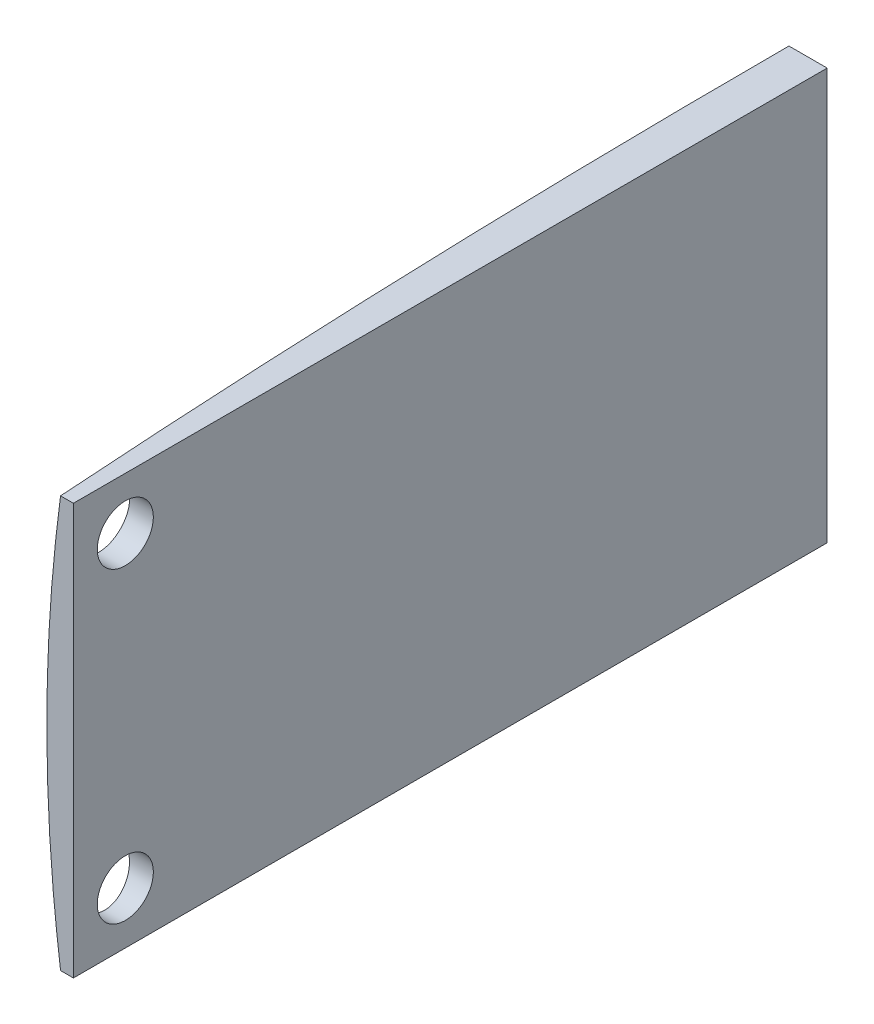
ISO-10303-21;
HEADER;
FILE_DESCRIPTION(('STEP AP214'),'2;1');
FILE_NAME('part.step','',(''),(''),'','','');
FILE_SCHEMA(('AUTOMOTIVE_DESIGN { 1 0 10303 214 1 1 1 1 }'));
ENDSEC;
DATA;
#1=APPLICATION_CONTEXT('core data for automotive mechanical design processes');
#2=APPLICATION_PROTOCOL_DEFINITION('international standard','automotive_design',2000,#1);
#3=PRODUCT_CONTEXT('',#1,'mechanical');
#4=PRODUCT('Part','Part','',(#3));
#5=PRODUCT_RELATED_PRODUCT_CATEGORY('part','',(#4));
#6=PRODUCT_DEFINITION_FORMATION('','',#4);
#7=PRODUCT_DEFINITION_CONTEXT('part definition',#1,'design');
#8=PRODUCT_DEFINITION('design','',#6,#7);
#9=PRODUCT_DEFINITION_SHAPE('','',#8);
#10=(LENGTH_UNIT() NAMED_UNIT(*) SI_UNIT(.MILLI.,.METRE.));
#11=(NAMED_UNIT(*) PLANE_ANGLE_UNIT() SI_UNIT($,.RADIAN.));
#12=(NAMED_UNIT(*) SI_UNIT($,.STERADIAN.) SOLID_ANGLE_UNIT());
#13=UNCERTAINTY_MEASURE_WITH_UNIT(LENGTH_MEASURE(1.E-05),#10,'distance_accuracy_value','');
#14=(GEOMETRIC_REPRESENTATION_CONTEXT(3) GLOBAL_UNCERTAINTY_ASSIGNED_CONTEXT((#13)) GLOBAL_UNIT_ASSIGNED_CONTEXT((#10,
#11,#12)) REPRESENTATION_CONTEXT('',''));
#15=CARTESIAN_POINT('',(0.,0.,0.));
#16=DIRECTION('',(0.,0.,1.));
#17=DIRECTION('',(1.,0.,0.));
#18=AXIS2_PLACEMENT_3D('',#15,#16,#17);
#19=CARTESIAN_POINT('',(-1.2E-05,25.146,0.));
#20=DIRECTION('',(0.,1.,0.));
#21=DIRECTION('',(0.,0.,1.));
#22=AXIS2_PLACEMENT_3D('',#19,#20,#21);
#23=PLANE('',#22);
#24=DIRECTION('',(1.,0.,0.));
#25=VECTOR('',#24,1.);
#26=CARTESIAN_POINT('',(-1.2E-05,25.146,0.));
#27=LINE('',#26,#25);
#28=CARTESIAN_POINT('',(1.67458040176172,25.146,0.));
#29=VERTEX_POINT('',#28);
#30=CARTESIAN_POINT('',(6.35,25.146,0.));
#31=VERTEX_POINT('',#30);
#32=EDGE_CURVE('E101',#29,#31,#27,.T.);
#33=ORIENTED_EDGE('',*,*,#32,.F.);
#34=CARTESIAN_POINT('',(1372.87,25.1460000000003,0.));
#35=DIRECTION('',(0.,-1.,0.));
#36=DIRECTION('',(1.,0.,0.));
#37=AXIS2_PLACEMENT_3D('',#34,#35,#36);
#38=CIRCLE('',#37,1371.19541959824);
#39=CARTESIAN_POINT('',(4.77801847127677,25.146,92.2020000000002));
#40=VERTEX_POINT('',#39);
#41=EDGE_CURVE('E94',#29,#40,#38,.F.);
#42=ORIENTED_EDGE('',*,*,#41,.T.);
#43=DIRECTION('',(1.,0.,0.));
#44=VECTOR('',#43,1.);
#45=CARTESIAN_POINT('',(-1.2E-05,25.146,92.2020000000001));
#46=LINE('',#45,#44);
#47=CARTESIAN_POINT('',(6.35,25.146,92.2020000000001));
#48=VERTEX_POINT('',#47);
#49=EDGE_CURVE('E140',#40,#48,#46,.T.);
#50=ORIENTED_EDGE('',*,*,#49,.T.);
#51=DIRECTION('',(0.,0.,1.));
#52=VECTOR('',#51,1.);
#53=CARTESIAN_POINT('',(6.35,25.146,-92.2020000000001));
#54=LINE('',#53,#52);
#55=EDGE_CURVE('E107',#31,#48,#54,.T.);
#56=ORIENTED_EDGE('',*,*,#55,.F.);
#57=EDGE_LOOP('',(#33,#42,#50,#56));
#58=FACE_BOUND('',#57,.T.);
#59=ADVANCED_FACE('F84',(#58),#23,.T.);
#60=CARTESIAN_POINT('',(-1.2E-05,-25.146,0.));
#61=DIRECTION('',(0.,1.,0.));
#62=DIRECTION('',(0.,0.,1.));
#63=AXIS2_PLACEMENT_3D('',#60,#61,#62);
#64=PLANE('',#63);
#65=CARTESIAN_POINT('',(1372.87,-25.1459999999997,0.));
#66=DIRECTION('',(0.,-1.,0.));
#67=DIRECTION('',(1.,0.,0.));
#68=AXIS2_PLACEMENT_3D('',#65,#66,#67);
#69=CIRCLE('',#68,1371.19541959824);
#70=CARTESIAN_POINT('',(1.67458040176194,-25.146,0.));
#71=VERTEX_POINT('',#70);
#72=CARTESIAN_POINT('',(4.77801847127669,-25.146,92.2020000000001));
#73=VERTEX_POINT('',#72);
#74=EDGE_CURVE('E135',#71,#73,#69,.F.);
#75=ORIENTED_EDGE('',*,*,#74,.F.);
#76=DIRECTION('',(1.,0.,0.));
#77=VECTOR('',#76,1.);
#78=CARTESIAN_POINT('',(-1.2E-05,-25.146,0.));
#79=LINE('',#78,#77);
#80=CARTESIAN_POINT('',(6.35,-25.146,0.));
#81=VERTEX_POINT('',#80);
#82=EDGE_CURVE('E125',#71,#81,#79,.T.);
#83=ORIENTED_EDGE('',*,*,#82,.T.);
#84=DIRECTION('',(0.,0.,-1.));
#85=VECTOR('',#84,1.);
#86=CARTESIAN_POINT('',(6.35,-25.146,-92.2020000000001));
#87=LINE('',#86,#85);
#88=CARTESIAN_POINT('',(6.35,-25.146,92.2020000000001));
#89=VERTEX_POINT('',#88);
#90=EDGE_CURVE('E133',#89,#81,#87,.T.);
#91=ORIENTED_EDGE('',*,*,#90,.F.);
#92=DIRECTION('',(1.,0.,0.));
#93=VECTOR('',#92,1.);
#94=CARTESIAN_POINT('',(-1.2E-05,-25.146,92.2020000000001));
#95=LINE('',#94,#93);
#96=EDGE_CURVE('E146',#73,#89,#95,.T.);
#97=ORIENTED_EDGE('',*,*,#96,.F.);
#98=EDGE_LOOP('',(#75,#83,#91,#97));
#99=FACE_BOUND('',#98,.T.);
#100=ADVANCED_FACE('F131',(#99),#64,.F.);
#101=CARTESIAN_POINT('',(-1.2E-05,0.,92.2020000000001));
#102=DIRECTION('',(0.,0.,1.));
#103=DIRECTION('',(1.,0.,0.));
#104=AXIS2_PLACEMENT_3D('',#101,#102,#103);
#105=PLANE('',#104);
#106=DIRECTION('',(0.,-1.,0.));
#107=VECTOR('',#106,1.);
#108=CARTESIAN_POINT('',(6.35,25.146,92.2020000000001));
#109=LINE('',#108,#107);
#110=EDGE_CURVE('E138',#48,#89,#109,.T.);
#111=ORIENTED_EDGE('',*,*,#110,.F.);
#112=ORIENTED_EDGE('',*,*,#49,.F.);
#113=CARTESIAN_POINT('',(4.77801847127677,25.146,92.2020000000002));
#114=CARTESIAN_POINT('',(4.59166788954078,23.7509410775316,92.2020000000001));
#115=CARTESIAN_POINT('',(4.42060734687266,22.3538353400213,92.2020000000001));
#116=CARTESIAN_POINT('',(4.10970318609752,19.5596122735176,92.202));
#117=CARTESIAN_POINT('',(3.96978429647136,18.162503317759,92.2020000000001));
#118=CARTESIAN_POINT('',(3.72113135185098,15.368275175018,92.2020000000001));
#119=CARTESIAN_POINT('',(3.61233662996028,13.9711613899426,92.2020000000001));
#120=CARTESIAN_POINT('',(3.42589241107428,11.1769289071129,92.2020000000001));
#121=CARTESIAN_POINT('',(3.34819715871108,9.77981326328064,92.2020000000001));
#122=CARTESIAN_POINT('',(3.22392182470786,6.98557999081025,92.2020000000001));
#123=CARTESIAN_POINT('',(3.17731110585369,5.58846372535655,92.2020000000001));
#124=CARTESIAN_POINT('',(3.11517989386899,2.79423141199114,92.2020000000001));
#125=CARTESIAN_POINT('',(3.09964402933586,1.3971157059956,92.2020000000001));
#126=CARTESIAN_POINT('',(3.09964402933586,-1.39711570599547,92.2020000000001));
#127=CARTESIAN_POINT('',(3.11517989386898,-2.79423141199101,92.2020000000001));
#128=CARTESIAN_POINT('',(3.17731110585368,-5.58846372535641,92.2020000000001));
#129=CARTESIAN_POINT('',(3.22392182470786,-6.98557999081011,92.2020000000001));
#130=CARTESIAN_POINT('',(3.34819715871109,-9.77981326328051,92.2020000000001));
#131=CARTESIAN_POINT('',(3.42589241107429,-11.1769289071128,92.2020000000001));
#132=CARTESIAN_POINT('',(3.61233662996026,-13.9711613899424,92.2020000000001));
#133=CARTESIAN_POINT('',(3.72113135185093,-15.3682751750178,92.2020000000001));
#134=CARTESIAN_POINT('',(3.96978429647142,-18.1625033177588,92.202));
#135=CARTESIAN_POINT('',(4.1097031860977,-19.5596122735174,92.202));
#136=CARTESIAN_POINT('',(4.42060734687293,-22.3538353400211,92.2020000000001));
#137=CARTESIAN_POINT('',(4.591667889541,-23.7509410775315,92.2020000000002));
#138=CARTESIAN_POINT('',(4.77801847127669,-25.1459999999999,92.2020000000004));
#139=B_SPLINE_CURVE_WITH_KNOTS('',3,(#113,#114,#115,#116,#117,#118,#119,#120,#121,#122,#123,
#124,#125,#126,#127,#128,#129,#130,#131,#132,#133,#134,#135,#136,#137,#138),.UNSPECIFIED.,.F.,
.F.,(4,2,2,2,2,2,2,2,2,2,2,2,4),(0.,4.22227231704978,8.43422552238614,12.6379120074765,
16.8353908464465,21.0287264716252,25.2199873193706,29.411248167116,33.6045837922947,
37.8020626312646,42.005749116355,46.2177023216914,50.4399746387411),.UNSPECIFIED.);
#140=EDGE_CURVE('E148',#40,#73,#139,.T.);
#141=ORIENTED_EDGE('',*,*,#140,.T.);
#142=ORIENTED_EDGE('',*,*,#96,.T.);
#143=EDGE_LOOP('',(#111,#112,#141,#142));
#144=FACE_BOUND('',#143,.T.);
#145=ADVANCED_FACE('F159',(#144),#105,.T.);
#146=CARTESIAN_POINT('',(1372.87,4.16333634234434E-13,0.));
#147=DIRECTION('',(0.,0.,1.));
#148=DIRECTION('',(-1.,0.,0.));
#149=AXIS2_PLACEMENT_3D('',#146,#147,#148);
#150=ELLIPSE('',#149,1372.87,509.27);
#151=TRIMMED_CURVE('',#150,(PARAMETER_VALUE(4.71238898038469)),
(PARAMETER_VALUE(7.85398163397448)),.T.,.PARAMETER.);
#152=CARTESIAN_POINT('',(1372.87,-509.27,0.));
#153=DIRECTION('',(0.,-1.,0.));
#154=AXIS1_PLACEMENT('',#152,#153);
#155=SURFACE_OF_REVOLUTION('',#151,#154);
#156=CARTESIAN_POINT('',(3.41350704445606,-18.7960000000001,82.4229999999998));
#157=CARTESIAN_POINT('',(3.39436924449468,-18.604119081168,82.4230081902815));
#158=CARTESIAN_POINT('',(3.37647283640744,-18.4119806937496,82.4391583975194));
#159=CARTESIAN_POINT('',(3.34367398813089,-18.032721251482,82.5034903101904));
#160=CARTESIAN_POINT('',(3.32877489487117,-17.8456060054322,82.5517075672993));
#161=CARTESIAN_POINT('',(3.30236212515313,-17.4819154557681,82.6789392865821));
#162=CARTESIAN_POINT('',(3.29084784954422,-17.3053382912111,82.7579482925061));
#163=CARTESIAN_POINT('',(3.27145073922401,-16.9678515354919,82.944579968504));
#164=CARTESIAN_POINT('',(3.26356701345374,-16.8069381075762,83.0521956073107));
#165=CARTESIAN_POINT('',(3.25156916637721,-16.5060861165859,83.2924638461406));
#166=CARTESIAN_POINT('',(3.24743798055722,-16.3660550481094,83.4249997651269));
#167=CARTESIAN_POINT('',(3.24287821607497,-16.1101166755428,83.7116744257249));
#168=CARTESIAN_POINT('',(3.24244969960849,-15.9942097767116,83.865813530173));
#169=CARTESIAN_POINT('',(3.24518102488363,-15.7901322264324,84.190821271636));
#170=CARTESIAN_POINT('',(3.24833056339875,-15.7018828650054,84.3616405851406));
#171=CARTESIAN_POINT('',(3.25800530284286,-15.5551429541796,84.7155236513587));
#172=CARTESIAN_POINT('',(3.26453050304707,-15.4966523983913,84.8985874014431));
#173=CARTESIAN_POINT('',(3.28070395535928,-15.4109726543096,85.2720190975045));
#174=CARTESIAN_POINT('',(3.29035633501652,-15.3838250527518,85.4623964022603));
#175=CARTESIAN_POINT('',(3.31246718546412,-15.3616612924836,85.8448482887754));
#176=CARTESIAN_POINT('',(3.32492570435777,-15.3666456846254,86.0369228995759));
#177=CARTESIAN_POINT('',(3.35235683562903,-15.4086100932746,86.4181848529888));
#178=CARTESIAN_POINT('',(3.36733983490417,-15.4457250331258,86.607356592118));
#179=CARTESIAN_POINT('',(3.39940306423604,-15.5509983545396,86.9766674521292));
#180=CARTESIAN_POINT('',(3.41648335189289,-15.6191575888449,87.1568063247403));
#181=CARTESIAN_POINT('',(3.45243620798375,-15.784965265031,87.5039387477428));
#182=CARTESIAN_POINT('',(3.4713177116811,-15.8827665853303,87.6708583521395));
#183=CARTESIAN_POINT('',(3.51037331166312,-16.1049055254905,87.9858208545134));
#184=CARTESIAN_POINT('',(3.53054744113028,-16.2292438267629,88.1338632676097));
#185=CARTESIAN_POINT('',(3.57184113580011,-16.5015425166185,88.4075706136945));
#186=CARTESIAN_POINT('',(3.59296462139546,-16.6496088847134,88.5331295316539));
#187=CARTESIAN_POINT('',(3.63560020075704,-16.9647351368877,88.7574988717373));
#188=CARTESIAN_POINT('',(3.65711230185124,-17.1317953794425,88.8563087889028));
#189=CARTESIAN_POINT('',(3.70008804217545,-17.4806424059071,89.0246138482065));
#190=CARTESIAN_POINT('',(3.72155140317321,-17.6624669344756,89.0940308440073));
#191=CARTESIAN_POINT('',(3.76384970917498,-18.0352963196945,89.2011777819392));
#192=CARTESIAN_POINT('',(3.78468465093096,-18.2263012237812,89.2389075603191));
#193=CARTESIAN_POINT('',(3.82517652506733,-18.6120145554397,89.2815522318385));
#194=CARTESIAN_POINT('',(3.84483376312878,-18.8067220045538,89.2864756769748));
#195=CARTESIAN_POINT('',(3.8824183866231,-19.1943354249303,89.2633139794076));
#196=CARTESIAN_POINT('',(3.9003457950794,-19.3872414201387,89.2352292760968));
#197=CARTESIAN_POINT('',(3.93385392945994,-19.7650410227885,89.1469204053276));
#198=CARTESIAN_POINT('',(3.94944272919586,-19.9499605503536,89.0868102355343));
#199=CARTESIAN_POINT('',(3.97781730870516,-20.3071832618522,88.9361431952549));
#200=CARTESIAN_POINT('',(3.99060317730041,-20.479486845456,88.8455872897919));
#201=CARTESIAN_POINT('',(4.01281796319867,-20.8054768614454,88.6371828582815));
#202=CARTESIAN_POINT('',(4.02226673317374,-20.9592696782183,88.5195028656688));
#203=CARTESIAN_POINT('',(4.03750913635277,-21.244982281914,88.2598587821897));
#204=CARTESIAN_POINT('',(4.04330290983706,-21.3769029081577,88.1178956235874));
#205=CARTESIAN_POINT('',(4.05090809279776,-21.6142804070262,87.8146957469961));
#206=CARTESIAN_POINT('',(4.05274429795652,-21.7198983640387,87.6535857461927));
#207=CARTESIAN_POINT('',(4.05233601958529,-21.9027096335515,87.3159817664341));
#208=CARTESIAN_POINT('',(4.05009164701617,-21.9799037188976,87.1394882059199));
#209=CARTESIAN_POINT('',(4.04151020934487,-22.103479307986,86.7767755191631));
#210=CARTESIAN_POINT('',(4.03518669060879,-22.1499617709341,86.5905904518314));
#211=CARTESIAN_POINT('',(4.0185884826606,-22.2112705070118,86.2132542495819));
#212=CARTESIAN_POINT('',(4.00831377505975,-22.2260966328115,86.022103091556));
#213=CARTESIAN_POINT('',(3.98407174010512,-22.2237744798371,85.6398498950725));
#214=CARTESIAN_POINT('',(3.97009705212219,-22.2065620482987,85.4487487231371));
#215=CARTESIAN_POINT('',(3.93889387011699,-22.1406484150268,85.0723330225271));
#216=CARTESIAN_POINT('',(3.9216652616403,-22.0919461055123,84.8870186976682));
#217=CARTESIAN_POINT('',(3.88437960714267,-21.9640944558238,84.5260545565194));
#218=CARTESIAN_POINT('',(3.86430381303016,-21.8847367506997,84.3504804941748));
#219=CARTESIAN_POINT('',(3.82208244768968,-21.6979346704605,84.0152535002833));
#220=CARTESIAN_POINT('',(3.79993685884129,-21.5904900562243,83.8556007042999));
#221=CARTESIAN_POINT('',(3.75412401414667,-21.3495795495937,83.5553446725656));
#222=CARTESIAN_POINT('',(3.73044569749712,-21.2159059939297,83.4149097309676));
#223=CARTESIAN_POINT('',(3.68252289717338,-20.9268604890281,83.1585261267026));
#224=CARTESIAN_POINT('',(3.65827825672448,-20.7714824706403,83.0425843358385));
#225=CARTESIAN_POINT('',(3.60989585481394,-20.4424877683889,82.8378860664344));
#226=CARTESIAN_POINT('',(3.58575950008213,-20.2687717515998,82.7492890397701));
#227=CARTESIAN_POINT('',(3.53854542534951,-19.9088696480864,82.6028118190587));
#228=CARTESIAN_POINT('',(3.51546648778287,-19.7226985434441,82.5448954420733));
#229=CARTESIAN_POINT('',(3.47915655607885,-19.412153359851,82.4765377484962));
#230=CARTESIAN_POINT('',(3.46539120048416,-19.2898716736846,82.4564950767566));
#231=CARTESIAN_POINT('',(3.4387469495815,-19.0437624626048,82.4297235533334));
#232=CARTESIAN_POINT('',(3.42586805482533,-18.9199349367293,82.4229947099374));
#233=CARTESIAN_POINT('',(3.41350704445606,-18.7960000000001,82.4229999999998));
#234=B_SPLINE_CURVE_WITH_KNOTS('',3,(#156,#157,#158,#159,#160,#161,#162,#163,#164,#165,#166,
#167,#168,#169,#170,#171,#172,#173,#174,#175,#176,#177,#178,#179,#180,#181,#182,#183,#184,#185,
#186,#187,#188,#189,#190,#191,#192,#193,#194,#195,#196,#197,#198,#199,#200,#201,#202,#203,#204,
#205,#206,#207,#208,#209,#210,#211,#212,#213,#214,#215,#216,#217,#218,#219,#220,#221,#222,#223,
#224,#225,#226,#227,#228,#229,#230,#231,#232,#233),.UNSPECIFIED.,.T.,.F.,(4,2,2,2,2,2,2,2,2,2,2,
2,2,2,2,2,2,2,2,2,2,2,2,2,2,2,2,2,2,2,2,2,2,2,2,2,2,2,4),(0.,0.578048596796749,1.15673912764821,
1.7353271620332,2.31377311568276,2.88957524715575,3.46538705067622,4.0395449627162,
4.61370275148024,5.1886214770235,5.76355005866543,6.34090466930412,6.9182751400105,
7.49867557600114,8.0790909171977,8.66217484973487,9.24526978876603,9.82990540127515,
10.4145440350094,10.9990302584374,11.5835087014819,12.1659204040164,12.7483136478824,
13.3271813917407,13.9060269170555,14.481235081436,15.0564276047369,15.6297197466272,
16.2030145566377,16.7774585450215,17.3519227428453,17.9303623038489,18.5088067896243,
19.0920306153492,19.6754178537877,20.2621453094476,20.848179264349,21.2215377624882,
21.5948964930304),.UNSPECIFIED.);
#235=CARTESIAN_POINT('',(3.41350704445606,-18.7960000000001,82.4229999999998));
#236=VERTEX_POINT('',#235);
#237=EDGE_CURVE('E142',#236,#236,#234,.T.);
#238=ORIENTED_EDGE('',*,*,#237,.T.);
#239=EDGE_LOOP('',(#238));
#240=FACE_BOUND('',#239,.T.);
#241=CARTESIAN_POINT('',(3.41350704445598,18.7959999999999,82.4229999999998));
#242=CARTESIAN_POINT('',(3.43285143874733,18.9899342123604,82.4230087967951));
#243=CARTESIAN_POINT('',(3.45349216199537,19.1838873183208,82.4395082336336));
#244=CARTESIAN_POINT('',(3.49674173018366,19.5661815490082,82.5049769408206));
#245=CARTESIAN_POINT('',(3.5193530900773,19.7545150782381,82.553988246343));
#246=CARTESIAN_POINT('',(3.56580340147424,20.1199613326186,82.6829826461303));
#247=CARTESIAN_POINT('',(3.58964146683852,20.2970819569938,82.7629436480853));
#248=CARTESIAN_POINT('',(3.63778047835323,20.6352133094126,82.9515161749183));
#249=CARTESIAN_POINT('',(3.66208130510925,20.7962281275471,83.0601204002036));
#250=CARTESIAN_POINT('',(3.71043191536408,21.0982075035725,83.3033541520448));
#251=CARTESIAN_POINT('',(3.73448055235577,21.2391014184506,83.4380716393404));
#252=CARTESIAN_POINT('',(3.78142819592543,21.4961614951994,83.7295189213401));
#253=CARTESIAN_POINT('',(3.8043271502157,21.612326533175,83.8862497159832));
#254=CARTESIAN_POINT('',(3.84816649764753,21.8164265404677,84.2171284476738));
#255=CARTESIAN_POINT('',(3.86910908395881,21.9043933968922,84.3912564171398));
#256=CARTESIAN_POINT('',(3.9083495637611,22.0496452066032,84.7521520871507));
#257=CARTESIAN_POINT('',(3.92664754938525,22.1069312289431,84.9389193470325));
#258=CARTESIAN_POINT('',(3.95987254470378,22.1887626937975,85.3184800011809));
#259=CARTESIAN_POINT('',(3.97482109247493,22.2135226149328,85.5112252519557));
#260=CARTESIAN_POINT('',(4.0010227601296,22.2301556784921,85.898379496841));
#261=CARTESIAN_POINT('',(4.01227606868469,22.2220305002461,86.0927884054882));
#262=CARTESIAN_POINT('',(4.03068051102811,22.1732266927135,86.4759995529114));
#263=CARTESIAN_POINT('',(4.03786549735965,22.1328236590833,86.6648352824224));
#264=CARTESIAN_POINT('',(4.04811624378847,22.0208939982147,87.0331620561294));
#265=CARTESIAN_POINT('',(4.0511821504727,21.9493684786617,87.2126534326473));
#266=CARTESIAN_POINT('',(4.05318565613306,21.7777057161149,87.556151578858));
#267=CARTESIAN_POINT('',(4.05214625731056,21.6777307968693,87.7202393670945));
#268=CARTESIAN_POINT('',(4.04613474331905,21.4518643535477,88.0294007491402));
#269=CARTESIAN_POINT('',(4.04116265892992,21.3259730323168,88.174474491756));
#270=CARTESIAN_POINT('',(4.02755922146101,21.0519003968141,88.4415087656326));
#271=CARTESIAN_POINT('',(4.01892843423861,20.9037225316794,88.5634728668268));
#272=CARTESIAN_POINT('',(3.99838365783053,20.5892860673975,88.7809434218898));
#273=CARTESIAN_POINT('',(3.98646960254214,20.4230271042607,88.8764493429929));
#274=CARTESIAN_POINT('',(3.95974861270303,20.076333586461,89.0387839144876));
#275=CARTESIAN_POINT('',(3.94492864107287,19.8958374241957,89.1054788203406));
#276=CARTESIAN_POINT('',(3.91293811515506,19.5264399908348,89.2077759473513));
#277=CARTESIAN_POINT('',(3.89576748250621,19.3375384396804,89.2433771316824));
#278=CARTESIAN_POINT('',(3.85948922331921,18.955375253387,89.2827109302625));
#279=CARTESIAN_POINT('',(3.84036972226657,18.7620932482263,89.2862347151685));
#280=CARTESIAN_POINT('',(3.80083412892098,18.3778056934989,89.2608470930008));
#281=CARTESIAN_POINT('',(3.78041799635694,18.186800214856,89.2319346780512));
#282=CARTESIAN_POINT('',(3.73871189140024,17.8113927780583,89.1422935263278));
#283=CARTESIAN_POINT('',(3.71741777192803,17.6270323633332,89.0813926814576));
#284=CARTESIAN_POINT('',(3.67458571701746,17.2712251860394,88.9294223316652));
#285=CARTESIAN_POINT('',(3.65304777718975,17.0997786563786,88.8383522827876));
#286=CARTESIAN_POINT('',(3.61017359656277,16.7742292817823,88.6283466743731));
#287=CARTESIAN_POINT('',(3.58883801996067,16.6201723509029,88.5093397887433));
#288=CARTESIAN_POINT('',(3.54690552875706,16.334318384465,88.24695393));
#289=CARTESIAN_POINT('',(3.5263086157204,16.2025213960619,88.1035749052579));
#290=CARTESIAN_POINT('',(3.48632415308032,15.9650641886846,87.7966010048184));
#291=CARTESIAN_POINT('',(3.46693581726233,15.8593868425893,87.6330194823757));
#292=CARTESIAN_POINT('',(3.42979073713918,15.6771389030755,87.2902033361215));
#293=CARTESIAN_POINT('',(3.41203396908498,15.6005678859353,87.1109689402268));
#294=CARTESIAN_POINT('',(3.37862650402734,15.4790110673776,86.7425743900735));
#295=CARTESIAN_POINT('',(3.36296896354281,15.4339205115351,86.5534494281249));
#296=CARTESIAN_POINT('',(3.33408538661235,15.3762919448401,86.1701199482594));
#297=CARTESIAN_POINT('',(3.32085929422311,15.3637531849413,85.9759155473288));
#298=CARTESIAN_POINT('',(3.29726793569863,15.37165777862,85.5889740501649));
#299=CARTESIAN_POINT('',(3.28688877017918,15.3919374272222,85.3962344597715));
#300=CARTESIAN_POINT('',(3.26923574255859,15.4646701550083,85.0167763927825));
#301=CARTESIAN_POINT('',(3.26196179476112,15.5171223462122,84.8300577501552));
#302=CARTESIAN_POINT('',(3.25083061981402,15.6524013343868,84.4689551619675));
#303=CARTESIAN_POINT('',(3.24695606136871,15.7350709759929,84.2945128690216));
#304=CARTESIAN_POINT('',(3.24277420653346,15.9284853544894,83.9619199223765));
#305=CARTESIAN_POINT('',(3.2424666800786,16.0392282802501,83.8037682186257));
#306=CARTESIAN_POINT('',(3.24554250189652,16.2851760144374,83.5088083286132));
#307=CARTESIAN_POINT('',(3.24891255870721,16.4202912680301,83.3719253098793));
#308=CARTESIAN_POINT('',(3.25935196995777,16.7114276721199,83.1226546776576));
#309=CARTESIAN_POINT('',(3.2664222214667,16.8674538854085,83.0102730136012));
#310=CARTESIAN_POINT('',(3.28417620152571,17.1959635877075,82.8131428850581));
#311=CARTESIAN_POINT('',(3.29486148963827,17.3684541565089,82.7284063780098));
#312=CARTESIAN_POINT('',(3.31962620854733,17.7247921579438,82.5890143998085));
#313=CARTESIAN_POINT('',(3.33370158312606,17.9086258245685,82.5343232342487));
#314=CARTESIAN_POINT('',(3.35890748906551,18.2106936144217,82.4712678287702));
#315=CARTESIAN_POINT('',(3.36909925463802,18.3270673813629,82.4531818761102));
#316=CARTESIAN_POINT('',(3.39053767627307,18.5609584539898,82.4290453062485));
#317=CARTESIAN_POINT('',(3.4017843305905,18.6784757577833,82.4229946691369));
#318=CARTESIAN_POINT('',(3.41350704445598,18.7959999999999,82.4229999999998));
#319=B_SPLINE_CURVE_WITH_KNOTS('',3,(#241,#242,#243,#244,#245,#246,#247,#248,#249,#250,#251,
#252,#253,#254,#255,#256,#257,#258,#259,#260,#261,#262,#263,#264,#265,#266,#267,#268,#269,#270,
#271,#272,#273,#274,#275,#276,#277,#278,#279,#280,#281,#282,#283,#284,#285,#286,#287,#288,#289,
#290,#291,#292,#293,#294,#295,#296,#297,#298,#299,#300,#301,#302,#303,#304,#305,#306,#307,#308,
#309,#310,#311,#312,#313,#314,#315,#316,#317,#318),.UNSPECIFIED.,.T.,.F.,(4,2,2,2,2,2,2,2,2,2,2,
2,2,2,2,2,2,2,2,2,2,2,2,2,2,2,2,2,2,2,2,2,2,2,2,2,2,2,4),(0.,0.584255427129484,1.16926772465987,
1.75386320037361,2.33830983836002,2.9247604734665,3.51123775630301,4.09704947914609,
4.68284078843875,5.26474964410858,5.84662878404709,6.42359213392339,7.00053495068407,
7.57424973081791,8.14796002071225,8.72158161254946,9.29521475407156,9.87148288520205,
10.447770231382,11.02780664455,11.6078610814369,12.1910688587767,12.774287152018,
13.3590109845595,13.9437360557615,14.52807668888,15.1124088150046,15.6947871280719,
16.2771520399704,16.8566209394689,17.4360738460247,18.0125550353425,18.5889990428141,
19.1633665549964,19.7378733804355,20.3126283705081,20.8866990564843,21.2407587610035,
21.5948178798075),.UNSPECIFIED.);
#320=CARTESIAN_POINT('',(3.41350704445598,18.7959999999999,82.4229999999998));
#321=VERTEX_POINT('',#320);
#322=EDGE_CURVE('E185',#321,#321,#319,.T.);
#323=ORIENTED_EDGE('',*,*,#322,.T.);
#324=EDGE_LOOP('',(#323));
#325=FACE_BOUND('',#324,.T.);
#326=ORIENTED_EDGE('',*,*,#41,.F.);
#327=CARTESIAN_POINT('',(1372.87,4.16333634234434E-13,0.));
#328=DIRECTION('',(0.,0.,1.));
#329=DIRECTION('',(-1.,0.,0.));
#330=AXIS2_PLACEMENT_3D('',#327,#328,#329);
#331=ELLIPSE('',#330,1372.87,509.27);
#332=EDGE_CURVE('E173',#29,#71,#331,.T.);
#333=ORIENTED_EDGE('',*,*,#332,.T.);
#334=ORIENTED_EDGE('',*,*,#74,.T.);
#335=ORIENTED_EDGE('',*,*,#140,.F.);
#336=EDGE_LOOP('',(#326,#333,#334,#335));
#337=FACE_BOUND('',#336,.T.);
#338=ADVANCED_FACE('F86',(#240,#325,#337),#155,.T.);
#339=CARTESIAN_POINT('',(6.35,0.,0.));
#340=DIRECTION('',(-1.,0.,0.));
#341=DIRECTION('',(0.,0.,1.));
#342=AXIS2_PLACEMENT_3D('',#339,#340,#341);
#343=PLANE('',#342);
#344=CARTESIAN_POINT('',(6.35,-18.796,85.8520000000001));
#345=DIRECTION('',(1.,0.,0.));
#346=DIRECTION('',(0.,0.,-1.));
#347=AXIS2_PLACEMENT_3D('',#344,#345,#346);
#348=CIRCLE('',#347,3.429);
#349=CARTESIAN_POINT('',(6.35,-18.796,82.4230000000001));
#350=VERTEX_POINT('',#349);
#351=EDGE_CURVE('E177',#350,#350,#348,.T.);
#352=ORIENTED_EDGE('',*,*,#351,.F.);
#353=EDGE_LOOP('',(#352));
#354=FACE_BOUND('',#353,.T.);
#355=CARTESIAN_POINT('',(6.35,18.796,85.8520000000001));
#356=DIRECTION('',(1.,0.,0.));
#357=DIRECTION('',(0.,0.,-1.));
#358=AXIS2_PLACEMENT_3D('',#355,#356,#357);
#359=CIRCLE('',#358,3.429);
#360=CARTESIAN_POINT('',(6.35,18.796,82.4230000000001));
#361=VERTEX_POINT('',#360);
#362=EDGE_CURVE('E180',#361,#361,#359,.T.);
#363=ORIENTED_EDGE('',*,*,#362,.F.);
#364=EDGE_LOOP('',(#363));
#365=FACE_BOUND('',#364,.T.);
#366=ORIENTED_EDGE('',*,*,#90,.T.);
#367=DIRECTION('',(0.,1.,0.));
#368=VECTOR('',#367,1.);
#369=CARTESIAN_POINT('',(6.35,0.,0.));
#370=LINE('',#369,#368);
#371=EDGE_CURVE('E13',#81,#31,#370,.T.);
#372=ORIENTED_EDGE('',*,*,#371,.T.);
#373=ORIENTED_EDGE('',*,*,#55,.T.);
#374=ORIENTED_EDGE('',*,*,#110,.T.);
#375=EDGE_LOOP('',(#366,#372,#373,#374));
#376=FACE_BOUND('',#375,.T.);
#377=ADVANCED_FACE('F137',(#354,#365,#376),#343,.F.);
#378=CARTESIAN_POINT('',(-3.55883561078287,18.796,85.8520000000001));
#379=DIRECTION('',(1.,0.,0.));
#380=DIRECTION('',(0.,0.,-1.));
#381=AXIS2_PLACEMENT_3D('',#378,#379,#380);
#382=CYLINDRICAL_SURFACE('',#381,3.429);
#383=ORIENTED_EDGE('',*,*,#362,.T.);
#384=EDGE_LOOP('',(#383));
#385=FACE_BOUND('',#384,.T.);
#386=ORIENTED_EDGE('',*,*,#322,.F.);
#387=EDGE_LOOP('',(#386));
#388=FACE_BOUND('',#387,.T.);
#389=ADVANCED_FACE('F195',(#385,#388),#382,.F.);
#390=CARTESIAN_POINT('',(-3.55883561078287,-18.796,85.8520000000001));
#391=DIRECTION('',(1.,0.,0.));
#392=DIRECTION('',(0.,0.,-1.));
#393=AXIS2_PLACEMENT_3D('',#390,#391,#392);
#394=CYLINDRICAL_SURFACE('',#393,3.429);
#395=ORIENTED_EDGE('',*,*,#351,.T.);
#396=EDGE_LOOP('',(#395));
#397=FACE_BOUND('',#396,.T.);
#398=ORIENTED_EDGE('',*,*,#237,.F.);
#399=EDGE_LOOP('',(#398));
#400=FACE_BOUND('',#399,.T.);
#401=ADVANCED_FACE('F198',(#397,#400),#394,.F.);
#402=CARTESIAN_POINT('',(0.,0.,0.));
#403=DIRECTION('',(0.,0.,1.));
#404=DIRECTION('',(1.,0.,0.));
#405=AXIS2_PLACEMENT_3D('',#402,#403,#404);
#406=PLANE('',#405);
#407=ORIENTED_EDGE('',*,*,#32,.T.);
#408=ORIENTED_EDGE('',*,*,#371,.F.);
#409=ORIENTED_EDGE('',*,*,#82,.F.);
#410=ORIENTED_EDGE('',*,*,#332,.F.);
#411=EDGE_LOOP('',(#407,#408,#409,#410));
#412=FACE_BOUND('',#411,.T.);
#413=ADVANCED_FACE('F124',(#412),#406,.F.);
#414=CLOSED_SHELL('',(#59,#100,#145,#338,#377,#389,#401,#413));
#415=MANIFOLD_SOLID_BREP('B2',#414);
#416=ADVANCED_BREP_SHAPE_REPRESENTATION('',(#18,#415),#14);
#417=SHAPE_DEFINITION_REPRESENTATION(#9,#416);
ENDSEC;
END-ISO-10303-21;
